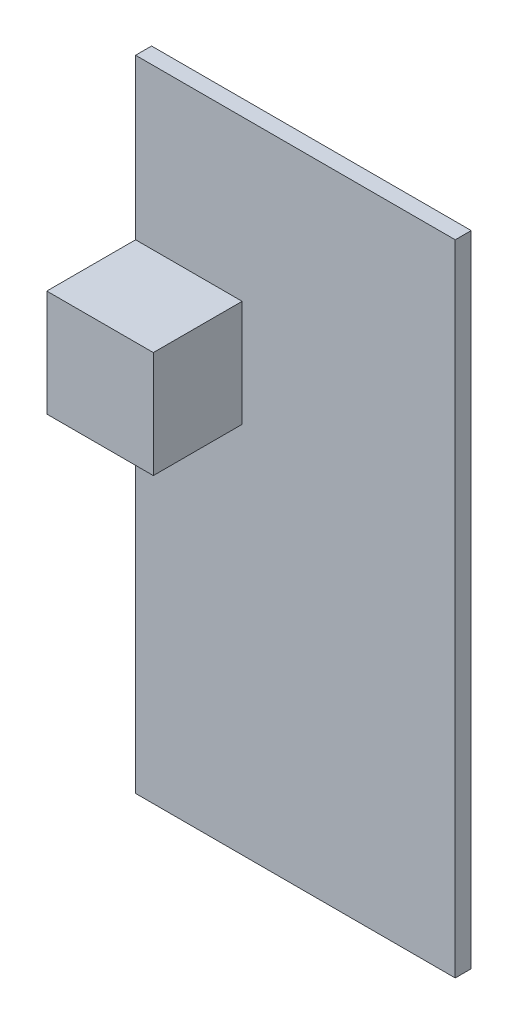
ISO-10303-21;
HEADER;
FILE_DESCRIPTION(('STEP AP214'),'2;1');
FILE_NAME('part.step','',(''),(''),'','','');
FILE_SCHEMA(('AUTOMOTIVE_DESIGN { 1 0 10303 214 1 1 1 1 }'));
ENDSEC;
DATA;
#1=APPLICATION_CONTEXT('core data for automotive mechanical design processes');
#2=APPLICATION_PROTOCOL_DEFINITION('international standard','automotive_design',2000,#1);
#3=PRODUCT_CONTEXT('',#1,'mechanical');
#4=PRODUCT('Part','Part','',(#3));
#5=PRODUCT_RELATED_PRODUCT_CATEGORY('part','',(#4));
#6=PRODUCT_DEFINITION_FORMATION('','',#4);
#7=PRODUCT_DEFINITION_CONTEXT('part definition',#1,'design');
#8=PRODUCT_DEFINITION('design','',#6,#7);
#9=PRODUCT_DEFINITION_SHAPE('','',#8);
#10=(LENGTH_UNIT() NAMED_UNIT(*) SI_UNIT(.MILLI.,.METRE.));
#11=(NAMED_UNIT(*) PLANE_ANGLE_UNIT() SI_UNIT($,.RADIAN.));
#12=(NAMED_UNIT(*) SI_UNIT($,.STERADIAN.) SOLID_ANGLE_UNIT());
#13=UNCERTAINTY_MEASURE_WITH_UNIT(LENGTH_MEASURE(1.E-05),#10,'distance_accuracy_value','');
#14=(GEOMETRIC_REPRESENTATION_CONTEXT(3) GLOBAL_UNCERTAINTY_ASSIGNED_CONTEXT((#13)) GLOBAL_UNIT_ASSIGNED_CONTEXT((#10,
#11,#12)) REPRESENTATION_CONTEXT('',''));
#15=CARTESIAN_POINT('',(0.,0.,0.));
#16=DIRECTION('',(0.,0.,1.));
#17=DIRECTION('',(1.,0.,0.));
#18=AXIS2_PLACEMENT_3D('',#15,#16,#17);
#19=CARTESIAN_POINT('',(-5.84684774358908,3.77094972067039,0.9));
#20=DIRECTION('',(1.,0.,0.));
#21=DIRECTION('',(0.,1.,0.));
#22=AXIS2_PLACEMENT_3D('',#19,#20,#21);
#23=PLANE('',#22);
#24=DIRECTION('',(0.,-1.,0.));
#25=VECTOR('',#24,1.);
#26=CARTESIAN_POINT('',(-5.84684774358908,3.77094972067039,0.));
#27=LINE('',#26,#25);
#28=CARTESIAN_POINT('',(-5.84684774358908,3.77094972067039,0.));
#29=VERTEX_POINT('',#28);
#30=CARTESIAN_POINT('',(-5.84684774358908,-32.2290502793296,0.));
#31=VERTEX_POINT('',#30);
#32=EDGE_CURVE('E119',#29,#31,#27,.T.);
#33=ORIENTED_EDGE('',*,*,#32,.T.);
#34=DIRECTION('',(0.,0.,-1.));
#35=VECTOR('',#34,1.);
#36=CARTESIAN_POINT('',(-5.84684774358908,-32.2290502793296,0.9));
#37=LINE('',#36,#35);
#38=CARTESIAN_POINT('',(-5.84684774358908,-32.2290502793296,0.9));
#39=VERTEX_POINT('',#38);
#40=EDGE_CURVE('E11',#39,#31,#37,.T.);
#41=ORIENTED_EDGE('',*,*,#40,.F.);
#42=DIRECTION('',(0.,-1.,0.));
#43=VECTOR('',#42,1.);
#44=CARTESIAN_POINT('',(-5.84684774358908,3.77094972067039,0.9));
#45=LINE('',#44,#43);
#46=CARTESIAN_POINT('',(-5.84684774358908,-11.2290502793296,0.9));
#47=VERTEX_POINT('',#46);
#48=EDGE_CURVE('E118',#47,#39,#45,.T.);
#49=ORIENTED_EDGE('',*,*,#48,.F.);
#50=DIRECTION('',(0.,0.,-1.));
#51=VECTOR('',#50,1.);
#52=CARTESIAN_POINT('',(-5.84684774358908,-11.2290502793296,5.9));
#53=LINE('',#52,#51);
#54=CARTESIAN_POINT('',(-5.84684774358908,-11.2290502793296,5.9));
#55=VERTEX_POINT('',#54);
#56=EDGE_CURVE('E100',#55,#47,#53,.T.);
#57=ORIENTED_EDGE('',*,*,#56,.F.);
#58=DIRECTION('',(0.,-1.,0.));
#59=VECTOR('',#58,1.);
#60=CARTESIAN_POINT('',(-5.84684774358908,-11.2290502793296,5.9));
#61=LINE('',#60,#59);
#62=CARTESIAN_POINT('',(-5.84684774358908,-5.22905027932961,5.9));
#63=VERTEX_POINT('',#62);
#64=EDGE_CURVE('E106',#63,#55,#61,.T.);
#65=ORIENTED_EDGE('',*,*,#64,.F.);
#66=DIRECTION('',(0.,0.,-1.));
#67=VECTOR('',#66,1.);
#68=CARTESIAN_POINT('',(-5.84684774358908,-5.22905027932961,5.9));
#69=LINE('',#68,#67);
#70=CARTESIAN_POINT('',(-5.84684774358908,-5.22905027932961,0.9));
#71=VERTEX_POINT('',#70);
#72=EDGE_CURVE('E163',#63,#71,#69,.T.);
#73=ORIENTED_EDGE('',*,*,#72,.T.);
#74=CARTESIAN_POINT('',(-5.84684774358908,3.77094972067039,0.9));
#75=VERTEX_POINT('',#74);
#76=EDGE_CURVE('E127',#75,#71,#45,.T.);
#77=ORIENTED_EDGE('',*,*,#76,.F.);
#78=DIRECTION('',(0.,0.,-1.));
#79=VECTOR('',#78,1.);
#80=CARTESIAN_POINT('',(-5.84684774358908,3.77094972067039,0.9));
#81=LINE('',#80,#79);
#82=EDGE_CURVE('E134',#75,#29,#81,.T.);
#83=ORIENTED_EDGE('',*,*,#82,.T.);
#84=EDGE_LOOP('',(#33,#41,#49,#57,#65,#73,#77,#83));
#85=FACE_BOUND('',#84,.T.);
#86=ADVANCED_FACE('F33',(#85),#23,.F.);
#87=CARTESIAN_POINT('',(-5.84684774358908,-32.2290502793296,0.9));
#88=DIRECTION('',(0.,1.,0.));
#89=DIRECTION('',(0.,0.,1.));
#90=AXIS2_PLACEMENT_3D('',#87,#88,#89);
#91=PLANE('',#90);
#92=DIRECTION('',(1.,0.,0.));
#93=VECTOR('',#92,1.);
#94=CARTESIAN_POINT('',(-5.84684774358908,-32.2290502793296,0.));
#95=LINE('',#94,#93);
#96=CARTESIAN_POINT('',(12.1531522564109,-32.2290502793296,0.));
#97=VERTEX_POINT('',#96);
#98=EDGE_CURVE('E121',#31,#97,#95,.T.);
#99=ORIENTED_EDGE('',*,*,#98,.T.);
#100=DIRECTION('',(0.,0.,-1.));
#101=VECTOR('',#100,1.);
#102=CARTESIAN_POINT('',(12.1531522564109,-32.2290502793296,0.9));
#103=LINE('',#102,#101);
#104=CARTESIAN_POINT('',(12.1531522564109,-32.2290502793296,0.9));
#105=VERTEX_POINT('',#104);
#106=EDGE_CURVE('E40',#105,#97,#103,.T.);
#107=ORIENTED_EDGE('',*,*,#106,.F.);
#108=DIRECTION('',(1.,0.,0.));
#109=VECTOR('',#108,1.);
#110=CARTESIAN_POINT('',(-5.84684774358908,-32.2290502793296,0.9));
#111=LINE('',#110,#109);
#112=EDGE_CURVE('E129',#39,#105,#111,.T.);
#113=ORIENTED_EDGE('',*,*,#112,.F.);
#114=ORIENTED_EDGE('',*,*,#40,.T.);
#115=EDGE_LOOP('',(#99,#107,#113,#114));
#116=FACE_BOUND('',#115,.T.);
#117=ADVANCED_FACE('F187',(#116),#91,.F.);
#118=CARTESIAN_POINT('',(12.1531522564109,3.77094972067039,0.9));
#119=DIRECTION('',(-1.,0.,0.));
#120=DIRECTION('',(0.,-1.,0.));
#121=AXIS2_PLACEMENT_3D('',#118,#119,#120);
#122=PLANE('',#121);
#123=DIRECTION('',(0.,1.,0.));
#124=VECTOR('',#123,1.);
#125=CARTESIAN_POINT('',(12.1531522564109,3.77094972067039,0.));
#126=LINE('',#125,#124);
#127=CARTESIAN_POINT('',(12.1531522564109,3.77094972067039,0.));
#128=VERTEX_POINT('',#127);
#129=EDGE_CURVE('E137',#97,#128,#126,.T.);
#130=ORIENTED_EDGE('',*,*,#129,.T.);
#131=DIRECTION('',(0.,0.,-1.));
#132=VECTOR('',#131,1.);
#133=CARTESIAN_POINT('',(12.1531522564109,3.77094972067039,0.9));
#134=LINE('',#133,#132);
#135=CARTESIAN_POINT('',(12.1531522564109,3.77094972067039,0.9));
#136=VERTEX_POINT('',#135);
#137=EDGE_CURVE('E143',#136,#128,#134,.T.);
#138=ORIENTED_EDGE('',*,*,#137,.F.);
#139=DIRECTION('',(0.,1.,0.));
#140=VECTOR('',#139,1.);
#141=CARTESIAN_POINT('',(12.1531522564109,3.77094972067039,0.9));
#142=LINE('',#141,#140);
#143=EDGE_CURVE('E131',#105,#136,#142,.T.);
#144=ORIENTED_EDGE('',*,*,#143,.F.);
#145=ORIENTED_EDGE('',*,*,#106,.T.);
#146=EDGE_LOOP('',(#130,#138,#144,#145));
#147=FACE_BOUND('',#146,.T.);
#148=ADVANCED_FACE('F150',(#147),#122,.F.);
#149=CARTESIAN_POINT('',(-5.84684774358908,3.77094972067039,0.9));
#150=DIRECTION('',(0.,-1.,0.));
#151=DIRECTION('',(0.,0.,-1.));
#152=AXIS2_PLACEMENT_3D('',#149,#150,#151);
#153=PLANE('',#152);
#154=DIRECTION('',(-1.,0.,0.));
#155=VECTOR('',#154,1.);
#156=CARTESIAN_POINT('',(-5.84684774358908,3.77094972067039,0.));
#157=LINE('',#156,#155);
#158=EDGE_CURVE('E139',#128,#29,#157,.T.);
#159=ORIENTED_EDGE('',*,*,#158,.T.);
#160=ORIENTED_EDGE('',*,*,#82,.F.);
#161=DIRECTION('',(-1.,0.,0.));
#162=VECTOR('',#161,1.);
#163=CARTESIAN_POINT('',(-5.84684774358908,3.77094972067039,0.9));
#164=LINE('',#163,#162);
#165=EDGE_CURVE('E133',#136,#75,#164,.T.);
#166=ORIENTED_EDGE('',*,*,#165,.F.);
#167=ORIENTED_EDGE('',*,*,#137,.T.);
#168=EDGE_LOOP('',(#159,#160,#166,#167));
#169=FACE_BOUND('',#168,.T.);
#170=ADVANCED_FACE('F160',(#169),#153,.F.);
#171=CARTESIAN_POINT('',(0.,0.,0.9));
#172=DIRECTION('',(0.,0.,1.));
#173=DIRECTION('',(1.,0.,0.));
#174=AXIS2_PLACEMENT_3D('',#171,#172,#173);
#175=PLANE('',#174);
#176=DIRECTION('',(-1.,0.,0.));
#177=VECTOR('',#176,1.);
#178=CARTESIAN_POINT('',(-5.84684774358908,-5.22905027932961,0.9));
#179=LINE('',#178,#177);
#180=CARTESIAN_POINT('',(0.153152256410917,-5.22905027932961,0.9));
#181=VERTEX_POINT('',#180);
#182=EDGE_CURVE('E47',#181,#71,#179,.T.);
#183=ORIENTED_EDGE('',*,*,#182,.F.);
#184=DIRECTION('',(0.,1.,0.));
#185=VECTOR('',#184,1.);
#186=CARTESIAN_POINT('',(0.153152256410917,-11.2290502793296,0.9));
#187=LINE('',#186,#185);
#188=CARTESIAN_POINT('',(0.153152256410917,-11.2290502793296,0.9));
#189=VERTEX_POINT('',#188);
#190=EDGE_CURVE('E169',#189,#181,#187,.T.);
#191=ORIENTED_EDGE('',*,*,#190,.F.);
#192=DIRECTION('',(1.,0.,0.));
#193=VECTOR('',#192,1.);
#194=CARTESIAN_POINT('',(-5.84684774358908,-11.2290502793296,0.9));
#195=LINE('',#194,#193);
#196=EDGE_CURVE('E53',#47,#189,#195,.T.);
#197=ORIENTED_EDGE('',*,*,#196,.F.);
#198=ORIENTED_EDGE('',*,*,#48,.T.);
#199=ORIENTED_EDGE('',*,*,#112,.T.);
#200=ORIENTED_EDGE('',*,*,#143,.T.);
#201=ORIENTED_EDGE('',*,*,#165,.T.);
#202=ORIENTED_EDGE('',*,*,#76,.T.);
#203=EDGE_LOOP('',(#183,#191,#197,#198,#199,#200,#201,#202));
#204=FACE_BOUND('',#203,.T.);
#205=ADVANCED_FACE('F164',(#204),#175,.T.);
#206=CARTESIAN_POINT('',(0.,0.,0.));
#207=DIRECTION('',(0.,0.,1.));
#208=DIRECTION('',(1.,0.,0.));
#209=AXIS2_PLACEMENT_3D('',#206,#207,#208);
#210=PLANE('',#209);
#211=ORIENTED_EDGE('',*,*,#32,.F.);
#212=ORIENTED_EDGE('',*,*,#158,.F.);
#213=ORIENTED_EDGE('',*,*,#129,.F.);
#214=ORIENTED_EDGE('',*,*,#98,.F.);
#215=EDGE_LOOP('',(#211,#212,#213,#214));
#216=FACE_BOUND('',#215,.T.);
#217=ADVANCED_FACE('F157',(#216),#210,.F.);
#218=CARTESIAN_POINT('',(-5.84684774358908,-11.2290502793296,5.9));
#219=DIRECTION('',(0.,1.,0.));
#220=DIRECTION('',(0.,0.,1.));
#221=AXIS2_PLACEMENT_3D('',#218,#219,#220);
#222=PLANE('',#221);
#223=ORIENTED_EDGE('',*,*,#196,.T.);
#224=DIRECTION('',(0.,0.,-1.));
#225=VECTOR('',#224,1.);
#226=CARTESIAN_POINT('',(0.153152256410917,-11.2290502793296,5.9));
#227=LINE('',#226,#225);
#228=CARTESIAN_POINT('',(0.153152256410917,-11.2290502793296,5.9));
#229=VERTEX_POINT('',#228);
#230=EDGE_CURVE('E102',#229,#189,#227,.T.);
#231=ORIENTED_EDGE('',*,*,#230,.F.);
#232=DIRECTION('',(1.,0.,0.));
#233=VECTOR('',#232,1.);
#234=CARTESIAN_POINT('',(-5.84684774358908,-11.2290502793296,5.9));
#235=LINE('',#234,#233);
#236=EDGE_CURVE('E96',#55,#229,#235,.T.);
#237=ORIENTED_EDGE('',*,*,#236,.F.);
#238=ORIENTED_EDGE('',*,*,#56,.T.);
#239=EDGE_LOOP('',(#223,#231,#237,#238));
#240=FACE_BOUND('',#239,.T.);
#241=ADVANCED_FACE('F98',(#240),#222,.F.);
#242=CARTESIAN_POINT('',(0.153152256410917,-11.2290502793296,5.9));
#243=DIRECTION('',(-1.,0.,0.));
#244=DIRECTION('',(0.,0.,1.));
#245=AXIS2_PLACEMENT_3D('',#242,#243,#244);
#246=PLANE('',#245);
#247=ORIENTED_EDGE('',*,*,#190,.T.);
#248=DIRECTION('',(0.,0.,-1.));
#249=VECTOR('',#248,1.);
#250=CARTESIAN_POINT('',(0.153152256410917,-5.22905027932961,5.9));
#251=LINE('',#250,#249);
#252=CARTESIAN_POINT('',(0.153152256410917,-5.22905027932961,5.9));
#253=VERTEX_POINT('',#252);
#254=EDGE_CURVE('E123',#253,#181,#251,.T.);
#255=ORIENTED_EDGE('',*,*,#254,.F.);
#256=DIRECTION('',(0.,1.,0.));
#257=VECTOR('',#256,1.);
#258=CARTESIAN_POINT('',(0.153152256410917,-11.2290502793296,5.9));
#259=LINE('',#258,#257);
#260=EDGE_CURVE('E105',#229,#253,#259,.T.);
#261=ORIENTED_EDGE('',*,*,#260,.F.);
#262=ORIENTED_EDGE('',*,*,#230,.T.);
#263=EDGE_LOOP('',(#247,#255,#261,#262));
#264=FACE_BOUND('',#263,.T.);
#265=ADVANCED_FACE('F177',(#264),#246,.F.);
#266=CARTESIAN_POINT('',(-5.84684774358908,-5.22905027932961,5.9));
#267=DIRECTION('',(0.,-1.,0.));
#268=DIRECTION('',(0.,0.,-1.));
#269=AXIS2_PLACEMENT_3D('',#266,#267,#268);
#270=PLANE('',#269);
#271=ORIENTED_EDGE('',*,*,#182,.T.);
#272=ORIENTED_EDGE('',*,*,#72,.F.);
#273=DIRECTION('',(-1.,0.,0.));
#274=VECTOR('',#273,1.);
#275=CARTESIAN_POINT('',(-5.84684774358908,-5.22905027932961,5.9));
#276=LINE('',#275,#274);
#277=EDGE_CURVE('E111',#253,#63,#276,.T.);
#278=ORIENTED_EDGE('',*,*,#277,.F.);
#279=ORIENTED_EDGE('',*,*,#254,.T.);
#280=EDGE_LOOP('',(#271,#272,#278,#279));
#281=FACE_BOUND('',#280,.T.);
#282=ADVANCED_FACE('F167',(#281),#270,.F.);
#283=CARTESIAN_POINT('',(0.,0.,5.9));
#284=DIRECTION('',(0.,0.,-1.));
#285=DIRECTION('',(-1.,0.,0.));
#286=AXIS2_PLACEMENT_3D('',#283,#284,#285);
#287=PLANE('',#286);
#288=ORIENTED_EDGE('',*,*,#64,.T.);
#289=ORIENTED_EDGE('',*,*,#236,.T.);
#290=ORIENTED_EDGE('',*,*,#260,.T.);
#291=ORIENTED_EDGE('',*,*,#277,.T.);
#292=EDGE_LOOP('',(#288,#289,#290,#291));
#293=FACE_BOUND('',#292,.T.);
#294=ADVANCED_FACE('F109',(#293),#287,.F.);
#295=CLOSED_SHELL('',(#86,#117,#148,#170,#205,#217,#241,#265,#282,#294));
#296=MANIFOLD_SOLID_BREP('B2',#295);
#297=ADVANCED_BREP_SHAPE_REPRESENTATION('',(#18,#296),#14);
#298=SHAPE_DEFINITION_REPRESENTATION(#9,#297);
ENDSEC;
END-ISO-10303-21;
